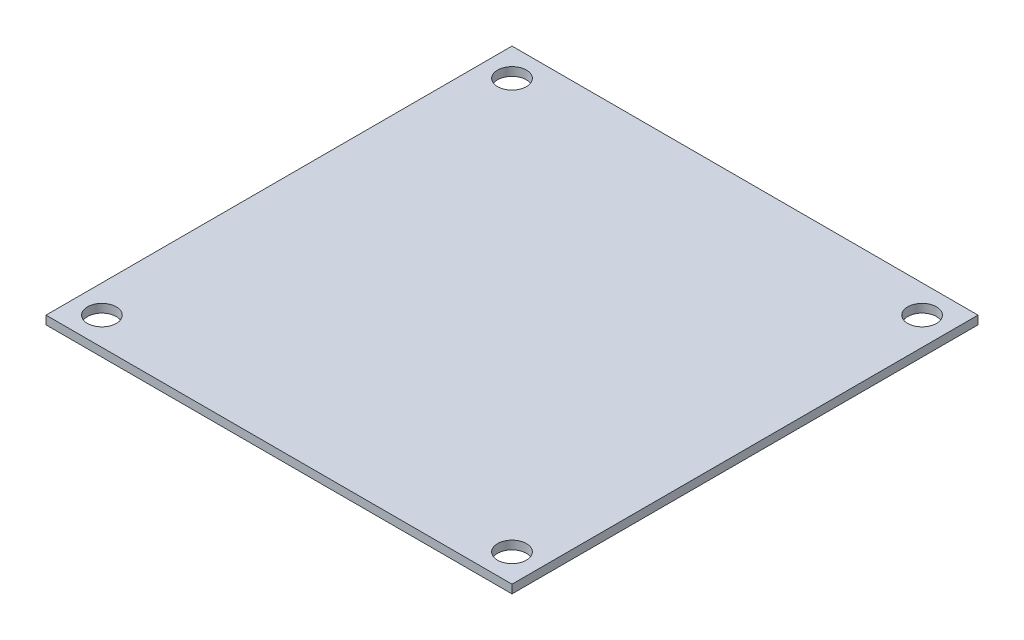
ISO-10303-21;
HEADER;
FILE_DESCRIPTION(('STEP AP214'),'2;1');
FILE_NAME('part.step','',(''),(''),'','','');
FILE_SCHEMA(('AUTOMOTIVE_DESIGN { 1 0 10303 214 1 1 1 1 }'));
ENDSEC;
DATA;
#1=APPLICATION_CONTEXT('core data for automotive mechanical design processes');
#2=APPLICATION_PROTOCOL_DEFINITION('international standard','automotive_design',2000,#1);
#3=PRODUCT_CONTEXT('',#1,'mechanical');
#4=PRODUCT('Part','Part','',(#3));
#5=PRODUCT_RELATED_PRODUCT_CATEGORY('part','',(#4));
#6=PRODUCT_DEFINITION_FORMATION('','',#4);
#7=PRODUCT_DEFINITION_CONTEXT('part definition',#1,'design');
#8=PRODUCT_DEFINITION('design','',#6,#7);
#9=PRODUCT_DEFINITION_SHAPE('','',#8);
#10=(LENGTH_UNIT() NAMED_UNIT(*) SI_UNIT(.MILLI.,.METRE.));
#11=(NAMED_UNIT(*) PLANE_ANGLE_UNIT() SI_UNIT($,.RADIAN.));
#12=(NAMED_UNIT(*) SI_UNIT($,.STERADIAN.) SOLID_ANGLE_UNIT());
#13=UNCERTAINTY_MEASURE_WITH_UNIT(LENGTH_MEASURE(1.E-05),#10,'distance_accuracy_value','');
#14=(GEOMETRIC_REPRESENTATION_CONTEXT(3) GLOBAL_UNCERTAINTY_ASSIGNED_CONTEXT((#13)) GLOBAL_UNIT_ASSIGNED_CONTEXT((#10,
#11,#12)) REPRESENTATION_CONTEXT('',''));
#15=CARTESIAN_POINT('',(0.,0.,0.));
#16=DIRECTION('',(0.,0.,1.));
#17=DIRECTION('',(1.,0.,0.));
#18=AXIS2_PLACEMENT_3D('',#15,#16,#17);
#19=CARTESIAN_POINT('',(27.5,0.5,27.5));
#20=DIRECTION('',(-1.,0.,0.));
#21=DIRECTION('',(0.,0.,1.));
#22=AXIS2_PLACEMENT_3D('',#19,#20,#21);
#23=PLANE('',#22);
#24=DIRECTION('',(0.,0.,-1.));
#25=VECTOR('',#24,1.);
#26=CARTESIAN_POINT('',(27.5,-0.5,27.5));
#27=LINE('',#26,#25);
#28=CARTESIAN_POINT('',(27.5,-0.5,27.5));
#29=VERTEX_POINT('',#28);
#30=CARTESIAN_POINT('',(27.5,-0.5,-27.5));
#31=VERTEX_POINT('',#30);
#32=EDGE_CURVE('E95',#29,#31,#27,.T.);
#33=ORIENTED_EDGE('',*,*,#32,.T.);
#34=DIRECTION('',(0.,-1.,0.));
#35=VECTOR('',#34,1.);
#36=CARTESIAN_POINT('',(27.5,0.5,-27.5));
#37=LINE('',#36,#35);
#38=CARTESIAN_POINT('',(27.5,0.5,-27.5));
#39=VERTEX_POINT('',#38);
#40=EDGE_CURVE('E11',#39,#31,#37,.T.);
#41=ORIENTED_EDGE('',*,*,#40,.F.);
#42=DIRECTION('',(0.,0.,-1.));
#43=VECTOR('',#42,1.);
#44=CARTESIAN_POINT('',(27.5,0.5,27.5));
#45=LINE('',#44,#43);
#46=CARTESIAN_POINT('',(27.5,0.5,27.5));
#47=VERTEX_POINT('',#46);
#48=EDGE_CURVE('E83',#47,#39,#45,.T.);
#49=ORIENTED_EDGE('',*,*,#48,.F.);
#50=DIRECTION('',(0.,-1.,0.));
#51=VECTOR('',#50,1.);
#52=CARTESIAN_POINT('',(27.5,0.5,27.5));
#53=LINE('',#52,#51);
#54=EDGE_CURVE('E91',#47,#29,#53,.T.);
#55=ORIENTED_EDGE('',*,*,#54,.T.);
#56=EDGE_LOOP('',(#33,#41,#49,#55));
#57=FACE_BOUND('',#56,.T.);
#58=ADVANCED_FACE('F32',(#57),#23,.F.);
#59=CARTESIAN_POINT('',(-27.5,0.5,-27.5));
#60=DIRECTION('',(0.,0.,1.));
#61=DIRECTION('',(1.,0.,0.));
#62=AXIS2_PLACEMENT_3D('',#59,#60,#61);
#63=PLANE('',#62);
#64=DIRECTION('',(-1.,0.,0.));
#65=VECTOR('',#64,1.);
#66=CARTESIAN_POINT('',(-27.5,-0.5,-27.5));
#67=LINE('',#66,#65);
#68=CARTESIAN_POINT('',(-27.5,-0.5,-27.5));
#69=VERTEX_POINT('',#68);
#70=EDGE_CURVE('E87',#31,#69,#67,.T.);
#71=ORIENTED_EDGE('',*,*,#70,.T.);
#72=DIRECTION('',(0.,-1.,0.));
#73=VECTOR('',#72,1.);
#74=CARTESIAN_POINT('',(-27.5,0.5,-27.5));
#75=LINE('',#74,#73);
#76=CARTESIAN_POINT('',(-27.5,0.5,-27.5));
#77=VERTEX_POINT('',#76);
#78=EDGE_CURVE('E40',#77,#69,#75,.T.);
#79=ORIENTED_EDGE('',*,*,#78,.F.);
#80=DIRECTION('',(-1.,0.,0.));
#81=VECTOR('',#80,1.);
#82=CARTESIAN_POINT('',(-27.5,0.5,-27.5));
#83=LINE('',#82,#81);
#84=EDGE_CURVE('E78',#39,#77,#83,.T.);
#85=ORIENTED_EDGE('',*,*,#84,.F.);
#86=ORIENTED_EDGE('',*,*,#40,.T.);
#87=EDGE_LOOP('',(#71,#79,#85,#86));
#88=FACE_BOUND('',#87,.T.);
#89=ADVANCED_FACE('F86',(#88),#63,.F.);
#90=CARTESIAN_POINT('',(-27.5,0.5,27.5));
#91=DIRECTION('',(1.,0.,0.));
#92=DIRECTION('',(0.,0.,-1.));
#93=AXIS2_PLACEMENT_3D('',#90,#91,#92);
#94=PLANE('',#93);
#95=DIRECTION('',(0.,0.,1.));
#96=VECTOR('',#95,1.);
#97=CARTESIAN_POINT('',(-27.5,-0.5,27.5));
#98=LINE('',#97,#96);
#99=CARTESIAN_POINT('',(-27.5,-0.5,27.5));
#100=VERTEX_POINT('',#99);
#101=EDGE_CURVE('E65',#69,#100,#98,.T.);
#102=ORIENTED_EDGE('',*,*,#101,.T.);
#103=DIRECTION('',(0.,-1.,0.));
#104=VECTOR('',#103,1.);
#105=CARTESIAN_POINT('',(-27.5,0.5,27.5));
#106=LINE('',#105,#104);
#107=CARTESIAN_POINT('',(-27.5,0.5,27.5));
#108=VERTEX_POINT('',#107);
#109=EDGE_CURVE('E88',#108,#100,#106,.T.);
#110=ORIENTED_EDGE('',*,*,#109,.F.);
#111=DIRECTION('',(0.,0.,1.));
#112=VECTOR('',#111,1.);
#113=CARTESIAN_POINT('',(-27.5,0.5,27.5));
#114=LINE('',#113,#112);
#115=EDGE_CURVE('E81',#77,#108,#114,.T.);
#116=ORIENTED_EDGE('',*,*,#115,.F.);
#117=ORIENTED_EDGE('',*,*,#78,.T.);
#118=EDGE_LOOP('',(#102,#110,#116,#117));
#119=FACE_BOUND('',#118,.T.);
#120=ADVANCED_FACE('F89',(#119),#94,.F.);
#121=CARTESIAN_POINT('',(-27.5,0.5,27.5));
#122=DIRECTION('',(0.,0.,-1.));
#123=DIRECTION('',(-1.,0.,0.));
#124=AXIS2_PLACEMENT_3D('',#121,#122,#123);
#125=PLANE('',#124);
#126=DIRECTION('',(1.,0.,0.));
#127=VECTOR('',#126,1.);
#128=CARTESIAN_POINT('',(-27.5,-0.5,27.5));
#129=LINE('',#128,#127);
#130=EDGE_CURVE('E71',#100,#29,#129,.T.);
#131=ORIENTED_EDGE('',*,*,#130,.T.);
#132=ORIENTED_EDGE('',*,*,#54,.F.);
#133=DIRECTION('',(1.,0.,0.));
#134=VECTOR('',#133,1.);
#135=CARTESIAN_POINT('',(-27.5,0.5,27.5));
#136=LINE('',#135,#134);
#137=EDGE_CURVE('E48',#108,#47,#136,.T.);
#138=ORIENTED_EDGE('',*,*,#137,.F.);
#139=ORIENTED_EDGE('',*,*,#109,.T.);
#140=EDGE_LOOP('',(#131,#132,#138,#139));
#141=FACE_BOUND('',#140,.T.);
#142=ADVANCED_FACE('F103',(#141),#125,.F.);
#143=CARTESIAN_POINT('',(0.,0.5,0.));
#144=DIRECTION('',(0.,-1.,0.));
#145=DIRECTION('',(0.,0.,-1.));
#146=AXIS2_PLACEMENT_3D('',#143,#144,#145);
#147=PLANE('',#146);
#148=CARTESIAN_POINT('',(24.2,0.5,24.2));
#149=DIRECTION('',(0.,1.,0.));
#150=DIRECTION('',(0.,0.,1.));
#151=AXIS2_PLACEMENT_3D('',#148,#149,#150);
#152=CIRCLE('',#151,1.7);
#153=CARTESIAN_POINT('',(24.2,0.5,25.9));
#154=VERTEX_POINT('',#153);
#155=EDGE_CURVE('E115',#154,#154,#152,.T.);
#156=ORIENTED_EDGE('',*,*,#155,.F.);
#157=EDGE_LOOP('',(#156));
#158=FACE_BOUND('',#157,.T.);
#159=CARTESIAN_POINT('',(-24.2,0.5,-24.2));
#160=DIRECTION('',(0.,1.,0.));
#161=DIRECTION('',(0.,0.,1.));
#162=AXIS2_PLACEMENT_3D('',#159,#160,#161);
#163=CIRCLE('',#162,1.7);
#164=CARTESIAN_POINT('',(-24.2,0.5,-22.5));
#165=VERTEX_POINT('',#164);
#166=EDGE_CURVE('E121',#165,#165,#163,.T.);
#167=ORIENTED_EDGE('',*,*,#166,.F.);
#168=EDGE_LOOP('',(#167));
#169=FACE_BOUND('',#168,.T.);
#170=CARTESIAN_POINT('',(-24.2,0.5,24.2));
#171=DIRECTION('',(0.,1.,0.));
#172=DIRECTION('',(0.,0.,1.));
#173=AXIS2_PLACEMENT_3D('',#170,#171,#172);
#174=CIRCLE('',#173,1.7);
#175=CARTESIAN_POINT('',(-24.2,0.5,25.9));
#176=VERTEX_POINT('',#175);
#177=EDGE_CURVE('E127',#176,#176,#174,.T.);
#178=ORIENTED_EDGE('',*,*,#177,.F.);
#179=EDGE_LOOP('',(#178));
#180=FACE_BOUND('',#179,.T.);
#181=CARTESIAN_POINT('',(24.2,0.5,-24.2));
#182=DIRECTION('',(0.,1.,0.));
#183=DIRECTION('',(0.,0.,1.));
#184=AXIS2_PLACEMENT_3D('',#181,#182,#183);
#185=CIRCLE('',#184,1.7);
#186=CARTESIAN_POINT('',(24.2,0.5,-22.5));
#187=VERTEX_POINT('',#186);
#188=EDGE_CURVE('E109',#187,#187,#185,.T.);
#189=ORIENTED_EDGE('',*,*,#188,.F.);
#190=EDGE_LOOP('',(#189));
#191=FACE_BOUND('',#190,.T.);
#192=ORIENTED_EDGE('',*,*,#48,.T.);
#193=ORIENTED_EDGE('',*,*,#84,.T.);
#194=ORIENTED_EDGE('',*,*,#115,.T.);
#195=ORIENTED_EDGE('',*,*,#137,.T.);
#196=EDGE_LOOP('',(#192,#193,#194,#195));
#197=FACE_BOUND('',#196,.T.);
#198=ADVANCED_FACE('F79',(#158,#169,#180,#191,#197),#147,.F.);
#199=CARTESIAN_POINT('',(0.,-0.5,0.));
#200=DIRECTION('',(0.,-1.,0.));
#201=DIRECTION('',(0.,0.,-1.));
#202=AXIS2_PLACEMENT_3D('',#199,#200,#201);
#203=PLANE('',#202);
#204=CARTESIAN_POINT('',(24.2,-0.5,24.2));
#205=DIRECTION('',(0.,1.,0.));
#206=DIRECTION('',(0.,0.,1.));
#207=AXIS2_PLACEMENT_3D('',#204,#205,#206);
#208=CIRCLE('',#207,1.7);
#209=CARTESIAN_POINT('',(24.2,-0.5,25.9));
#210=VERTEX_POINT('',#209);
#211=EDGE_CURVE('E118',#210,#210,#208,.T.);
#212=ORIENTED_EDGE('',*,*,#211,.T.);
#213=EDGE_LOOP('',(#212));
#214=FACE_BOUND('',#213,.T.);
#215=CARTESIAN_POINT('',(-24.2,-0.5,-24.2));
#216=DIRECTION('',(0.,1.,0.));
#217=DIRECTION('',(0.,0.,1.));
#218=AXIS2_PLACEMENT_3D('',#215,#216,#217);
#219=CIRCLE('',#218,1.7);
#220=CARTESIAN_POINT('',(-24.2,-0.5,-22.5));
#221=VERTEX_POINT('',#220);
#222=EDGE_CURVE('E124',#221,#221,#219,.T.);
#223=ORIENTED_EDGE('',*,*,#222,.T.);
#224=EDGE_LOOP('',(#223));
#225=FACE_BOUND('',#224,.T.);
#226=CARTESIAN_POINT('',(-24.2,-0.5,24.2));
#227=DIRECTION('',(0.,1.,0.));
#228=DIRECTION('',(0.,0.,1.));
#229=AXIS2_PLACEMENT_3D('',#226,#227,#228);
#230=CIRCLE('',#229,1.7);
#231=CARTESIAN_POINT('',(-24.2,-0.5,25.9));
#232=VERTEX_POINT('',#231);
#233=EDGE_CURVE('E112',#232,#232,#230,.T.);
#234=ORIENTED_EDGE('',*,*,#233,.T.);
#235=EDGE_LOOP('',(#234));
#236=FACE_BOUND('',#235,.T.);
#237=CARTESIAN_POINT('',(24.2,-0.5,-24.2));
#238=DIRECTION('',(0.,1.,0.));
#239=DIRECTION('',(0.,0.,1.));
#240=AXIS2_PLACEMENT_3D('',#237,#238,#239);
#241=CIRCLE('',#240,1.7);
#242=CARTESIAN_POINT('',(24.2,-0.5,-22.5));
#243=VERTEX_POINT('',#242);
#244=EDGE_CURVE('E98',#243,#243,#241,.T.);
#245=ORIENTED_EDGE('',*,*,#244,.T.);
#246=EDGE_LOOP('',(#245));
#247=FACE_BOUND('',#246,.T.);
#248=ORIENTED_EDGE('',*,*,#32,.F.);
#249=ORIENTED_EDGE('',*,*,#130,.F.);
#250=ORIENTED_EDGE('',*,*,#101,.F.);
#251=ORIENTED_EDGE('',*,*,#70,.F.);
#252=EDGE_LOOP('',(#248,#249,#250,#251));
#253=FACE_BOUND('',#252,.T.);
#254=ADVANCED_FACE('F106',(#214,#225,#236,#247,#253),#203,.T.);
#255=CARTESIAN_POINT('',(24.2,-0.5,-24.2));
#256=DIRECTION('',(0.,1.,0.));
#257=DIRECTION('',(0.,0.,1.));
#258=AXIS2_PLACEMENT_3D('',#255,#256,#257);
#259=CYLINDRICAL_SURFACE('',#258,1.7);
#260=ORIENTED_EDGE('',*,*,#244,.F.);
#261=EDGE_LOOP('',(#260));
#262=FACE_BOUND('',#261,.T.);
#263=ORIENTED_EDGE('',*,*,#188,.T.);
#264=EDGE_LOOP('',(#263));
#265=FACE_BOUND('',#264,.T.);
#266=ADVANCED_FACE('F139',(#262,#265),#259,.F.);
#267=CARTESIAN_POINT('',(-24.2,-0.5,24.2));
#268=DIRECTION('',(0.,1.,0.));
#269=DIRECTION('',(0.,0.,1.));
#270=AXIS2_PLACEMENT_3D('',#267,#268,#269);
#271=CYLINDRICAL_SURFACE('',#270,1.7);
#272=ORIENTED_EDGE('',*,*,#233,.F.);
#273=EDGE_LOOP('',(#272));
#274=FACE_BOUND('',#273,.T.);
#275=ORIENTED_EDGE('',*,*,#177,.T.);
#276=EDGE_LOOP('',(#275));
#277=FACE_BOUND('',#276,.T.);
#278=ADVANCED_FACE('F135',(#274,#277),#271,.F.);
#279=CARTESIAN_POINT('',(-24.2,-0.5,-24.2));
#280=DIRECTION('',(0.,1.,0.));
#281=DIRECTION('',(0.,0.,1.));
#282=AXIS2_PLACEMENT_3D('',#279,#280,#281);
#283=CYLINDRICAL_SURFACE('',#282,1.7);
#284=ORIENTED_EDGE('',*,*,#222,.F.);
#285=EDGE_LOOP('',(#284));
#286=FACE_BOUND('',#285,.T.);
#287=ORIENTED_EDGE('',*,*,#166,.T.);
#288=EDGE_LOOP('',(#287));
#289=FACE_BOUND('',#288,.T.);
#290=ADVANCED_FACE('F138',(#286,#289),#283,.F.);
#291=CARTESIAN_POINT('',(24.2,-0.5,24.2));
#292=DIRECTION('',(0.,1.,0.));
#293=DIRECTION('',(0.,0.,1.));
#294=AXIS2_PLACEMENT_3D('',#291,#292,#293);
#295=CYLINDRICAL_SURFACE('',#294,1.7);
#296=ORIENTED_EDGE('',*,*,#211,.F.);
#297=EDGE_LOOP('',(#296));
#298=FACE_BOUND('',#297,.T.);
#299=ORIENTED_EDGE('',*,*,#155,.T.);
#300=EDGE_LOOP('',(#299));
#301=FACE_BOUND('',#300,.T.);
#302=ADVANCED_FACE('F200',(#298,#301),#295,.F.);
#303=CLOSED_SHELL('',(#58,#89,#120,#142,#198,#254,#266,#278,#290,#302));
#304=MANIFOLD_SOLID_BREP('B2',#303);
#305=ADVANCED_BREP_SHAPE_REPRESENTATION('',(#18,#304),#14);
#306=SHAPE_DEFINITION_REPRESENTATION(#9,#305);
ENDSEC;
END-ISO-10303-21;
